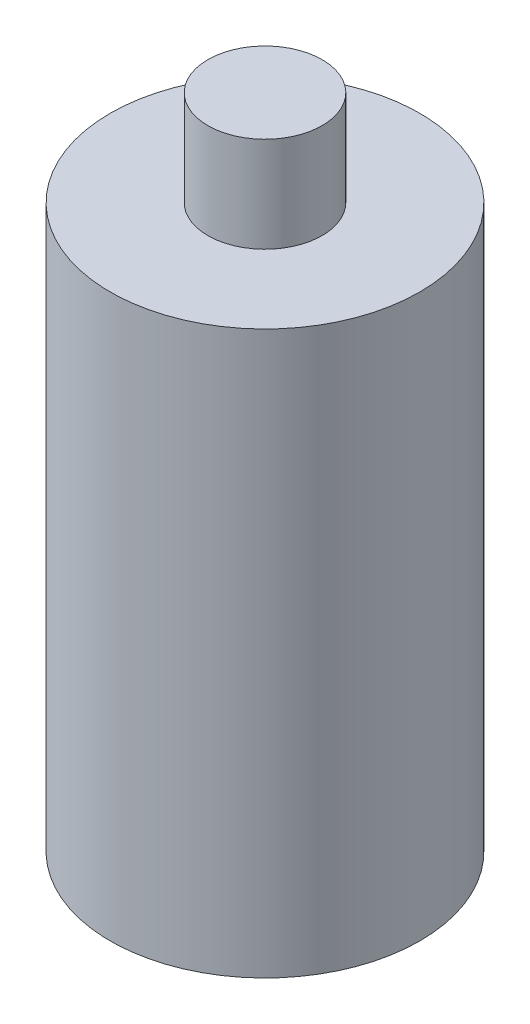
ISO-10303-21;
HEADER;
FILE_DESCRIPTION(('STEP AP214'),'2;1');
FILE_NAME('part.step','',(''),(''),'','','');
FILE_SCHEMA(('AUTOMOTIVE_DESIGN { 1 0 10303 214 1 1 1 1 }'));
ENDSEC;
DATA;
#1=APPLICATION_CONTEXT('core data for automotive mechanical design processes');
#2=APPLICATION_PROTOCOL_DEFINITION('international standard','automotive_design',2000,#1);
#3=PRODUCT_CONTEXT('',#1,'mechanical');
#4=PRODUCT('Part','Part','',(#3));
#5=PRODUCT_RELATED_PRODUCT_CATEGORY('part','',(#4));
#6=PRODUCT_DEFINITION_FORMATION('','',#4);
#7=PRODUCT_DEFINITION_CONTEXT('part definition',#1,'design');
#8=PRODUCT_DEFINITION('design','',#6,#7);
#9=PRODUCT_DEFINITION_SHAPE('','',#8);
#10=(LENGTH_UNIT() NAMED_UNIT(*) SI_UNIT(.MILLI.,.METRE.));
#11=(NAMED_UNIT(*) PLANE_ANGLE_UNIT() SI_UNIT($,.RADIAN.));
#12=(NAMED_UNIT(*) SI_UNIT($,.STERADIAN.) SOLID_ANGLE_UNIT());
#13=UNCERTAINTY_MEASURE_WITH_UNIT(LENGTH_MEASURE(1.E-05),#10,'distance_accuracy_value','');
#14=(GEOMETRIC_REPRESENTATION_CONTEXT(3) GLOBAL_UNCERTAINTY_ASSIGNED_CONTEXT((#13)) GLOBAL_UNIT_ASSIGNED_CONTEXT((#10,
#11,#12)) REPRESENTATION_CONTEXT('',''));
#15=CARTESIAN_POINT('',(0.,0.,0.));
#16=DIRECTION('',(0.,0.,1.));
#17=DIRECTION('',(1.,0.,0.));
#18=AXIS2_PLACEMENT_3D('',#15,#16,#17);
#19=CARTESIAN_POINT('',(0.,0.,0.));
#20=DIRECTION('',(0.,1.,0.));
#21=DIRECTION('',(-1.,0.,0.));
#22=AXIS2_PLACEMENT_3D('',#19,#20,#21);
#23=PLANE('',#22);
#24=CARTESIAN_POINT('',(0.,0.,0.));
#25=DIRECTION('',(0.,1.,0.));
#26=DIRECTION('',(-1.,0.,0.));
#27=AXIS2_PLACEMENT_3D('',#24,#25,#26);
#28=CIRCLE('',#27,3.25);
#29=CARTESIAN_POINT('',(-3.25,0.,0.));
#30=VERTEX_POINT('',#29);
#31=EDGE_CURVE('E10',#30,#30,#28,.T.);
#32=ORIENTED_EDGE('',*,*,#31,.F.);
#33=EDGE_LOOP('',(#32));
#34=FACE_BOUND('',#33,.T.);
#35=ADVANCED_FACE('F43',(#34),#23,.F.);
#36=CARTESIAN_POINT('',(0.,13.8,0.));
#37=DIRECTION('',(0.,1.,0.));
#38=DIRECTION('',(-1.,0.,0.));
#39=AXIS2_PLACEMENT_3D('',#36,#37,#38);
#40=CYLINDRICAL_SURFACE('',#39,3.25);
#41=CARTESIAN_POINT('',(0.,11.8,0.));
#42=DIRECTION('',(0.,1.,0.));
#43=DIRECTION('',(-1.,0.,0.));
#44=AXIS2_PLACEMENT_3D('',#41,#42,#43);
#45=CIRCLE('',#44,3.25);
#46=CARTESIAN_POINT('',(-3.25,11.8,0.));
#47=VERTEX_POINT('',#46);
#48=EDGE_CURVE('E50',#47,#47,#45,.T.);
#49=ORIENTED_EDGE('',*,*,#48,.F.);
#50=EDGE_LOOP('',(#49));
#51=FACE_BOUND('',#50,.T.);
#52=ORIENTED_EDGE('',*,*,#31,.T.);
#53=EDGE_LOOP('',(#52));
#54=FACE_BOUND('',#53,.T.);
#55=ADVANCED_FACE('F77',(#51,#54),#40,.T.);
#56=CARTESIAN_POINT('',(3.25,11.8,0.));
#57=DIRECTION('',(0.,-1.,0.));
#58=DIRECTION('',(1.,0.,0.));
#59=AXIS2_PLACEMENT_3D('',#56,#57,#58);
#60=PLANE('',#59);
#61=CARTESIAN_POINT('',(0.,11.8,0.));
#62=DIRECTION('',(0.,1.,0.));
#63=DIRECTION('',(-1.,0.,0.));
#64=AXIS2_PLACEMENT_3D('',#61,#62,#63);
#65=CIRCLE('',#64,1.2);
#66=CARTESIAN_POINT('',(-1.2,11.8,0.));
#67=VERTEX_POINT('',#66);
#68=EDGE_CURVE('E55',#67,#67,#65,.T.);
#69=ORIENTED_EDGE('',*,*,#68,.F.);
#70=EDGE_LOOP('',(#69));
#71=FACE_BOUND('',#70,.T.);
#72=ORIENTED_EDGE('',*,*,#48,.T.);
#73=EDGE_LOOP('',(#72));
#74=FACE_BOUND('',#73,.T.);
#75=ADVANCED_FACE('F72',(#71,#74),#60,.F.);
#76=CARTESIAN_POINT('',(0.,13.8,0.));
#77=DIRECTION('',(0.,1.,0.));
#78=DIRECTION('',(-1.,0.,0.));
#79=AXIS2_PLACEMENT_3D('',#76,#77,#78);
#80=CYLINDRICAL_SURFACE('',#79,1.2);
#81=CARTESIAN_POINT('',(0.,13.8,0.));
#82=DIRECTION('',(0.,1.,0.));
#83=DIRECTION('',(-1.,0.,0.));
#84=AXIS2_PLACEMENT_3D('',#81,#82,#83);
#85=CIRCLE('',#84,1.2);
#86=CARTESIAN_POINT('',(-1.2,13.8,0.));
#87=VERTEX_POINT('',#86);
#88=EDGE_CURVE('E60',#87,#87,#85,.T.);
#89=ORIENTED_EDGE('',*,*,#88,.F.);
#90=EDGE_LOOP('',(#89));
#91=FACE_BOUND('',#90,.T.);
#92=ORIENTED_EDGE('',*,*,#68,.T.);
#93=EDGE_LOOP('',(#92));
#94=FACE_BOUND('',#93,.T.);
#95=ADVANCED_FACE('F69',(#91,#94),#80,.T.);
#96=CARTESIAN_POINT('',(1.2,13.8,0.));
#97=DIRECTION('',(0.,-1.,0.));
#98=DIRECTION('',(1.,0.,0.));
#99=AXIS2_PLACEMENT_3D('',#96,#97,#98);
#100=PLANE('',#99);
#101=ORIENTED_EDGE('',*,*,#88,.T.);
#102=EDGE_LOOP('',(#101));
#103=FACE_BOUND('',#102,.T.);
#104=ADVANCED_FACE('F67',(#103),#100,.F.);
#105=CLOSED_SHELL('',(#35,#55,#75,#95,#104));
#106=MANIFOLD_SOLID_BREP('B2',#105);
#107=ADVANCED_BREP_SHAPE_REPRESENTATION('',(#18,#106),#14);
#108=SHAPE_DEFINITION_REPRESENTATION(#9,#107);
ENDSEC;
END-ISO-10303-21;
